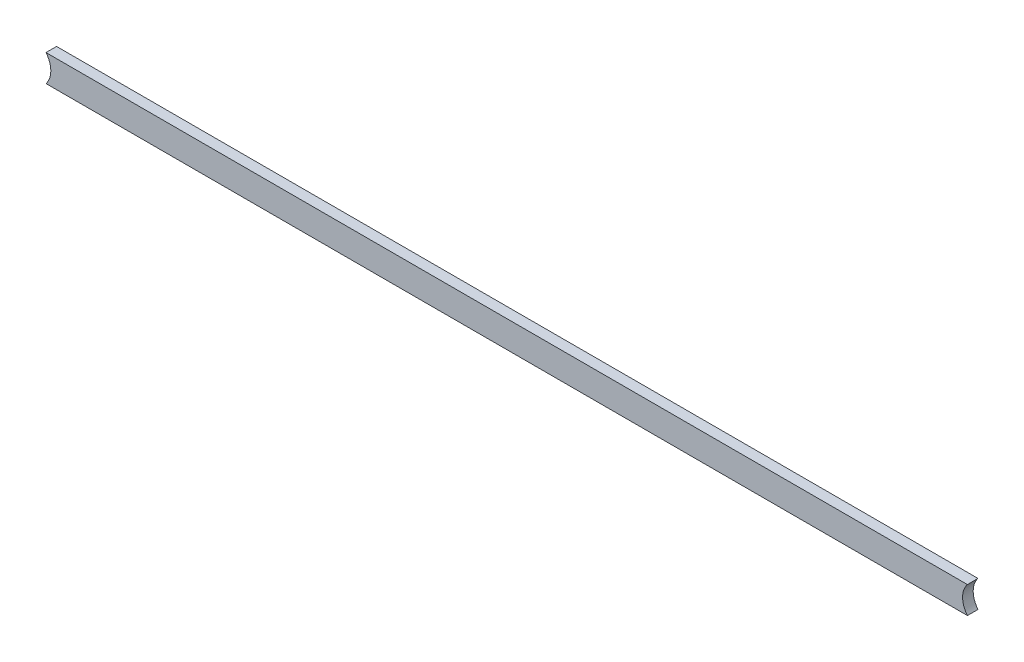
ISO-10303-21;
HEADER;
FILE_DESCRIPTION(('STEP AP214'),'2;1');
FILE_NAME('part.step','',(''),(''),'','','');
FILE_SCHEMA(('AUTOMOTIVE_DESIGN { 1 0 10303 214 1 1 1 1 }'));
ENDSEC;
DATA;
#1=APPLICATION_CONTEXT('core data for automotive mechanical design processes');
#2=APPLICATION_PROTOCOL_DEFINITION('international standard','automotive_design',2000,#1);
#3=PRODUCT_CONTEXT('',#1,'mechanical');
#4=PRODUCT('Part','Part','',(#3));
#5=PRODUCT_RELATED_PRODUCT_CATEGORY('part','',(#4));
#6=PRODUCT_DEFINITION_FORMATION('','',#4);
#7=PRODUCT_DEFINITION_CONTEXT('part definition',#1,'design');
#8=PRODUCT_DEFINITION('design','',#6,#7);
#9=PRODUCT_DEFINITION_SHAPE('','',#8);
#10=(LENGTH_UNIT() NAMED_UNIT(*) SI_UNIT(.MILLI.,.METRE.));
#11=(NAMED_UNIT(*) PLANE_ANGLE_UNIT() SI_UNIT($,.RADIAN.));
#12=(NAMED_UNIT(*) SI_UNIT($,.STERADIAN.) SOLID_ANGLE_UNIT());
#13=UNCERTAINTY_MEASURE_WITH_UNIT(LENGTH_MEASURE(1.E-05),#10,'distance_accuracy_value','');
#14=(GEOMETRIC_REPRESENTATION_CONTEXT(3) GLOBAL_UNCERTAINTY_ASSIGNED_CONTEXT((#13)) GLOBAL_UNIT_ASSIGNED_CONTEXT((#10,
#11,#12)) REPRESENTATION_CONTEXT('',''));
#15=CARTESIAN_POINT('',(0.,0.,0.));
#16=DIRECTION('',(0.,0.,1.));
#17=DIRECTION('',(1.,0.,0.));
#18=AXIS2_PLACEMENT_3D('',#15,#16,#17);
#19=CARTESIAN_POINT('',(112.831003818748,57.404,0.));
#20=DIRECTION('',(0.,1.,0.));
#21=DIRECTION('',(1.,0.,0.));
#22=AXIS2_PLACEMENT_3D('',#19,#20,#21);
#23=PLANE('',#22);
#24=DIRECTION('',(1.,0.,0.));
#25=VECTOR('',#24,1.);
#26=CARTESIAN_POINT('',(112.522,57.404,0.1999996));
#27=LINE('',#26,#25);
#28=CARTESIAN_POINT('',(112.831003818748,57.404,0.1999996));
#29=VERTEX_POINT('',#28);
#30=CARTESIAN_POINT('',(130.246996181252,57.404,0.1999996));
#31=VERTEX_POINT('',#30);
#32=EDGE_CURVE('E11',#29,#31,#27,.T.);
#33=ORIENTED_EDGE('',*,*,#32,.F.);
#34=DIRECTION('',(0.,0.,1.));
#35=VECTOR('',#34,1.);
#36=CARTESIAN_POINT('',(112.831003818748,57.404,0.));
#37=LINE('',#36,#35);
#38=CARTESIAN_POINT('',(112.831003818748,57.404,0.));
#39=VERTEX_POINT('',#38);
#40=EDGE_CURVE('E24',#39,#29,#37,.T.);
#41=ORIENTED_EDGE('',*,*,#40,.F.);
#42=DIRECTION('',(1.,0.,0.));
#43=VECTOR('',#42,1.);
#44=CARTESIAN_POINT('',(112.522,57.404,0.));
#45=LINE('',#44,#43);
#46=CARTESIAN_POINT('',(130.246996181252,57.404,0.));
#47=VERTEX_POINT('',#46);
#48=EDGE_CURVE('E82',#39,#47,#45,.T.);
#49=ORIENTED_EDGE('',*,*,#48,.T.);
#50=DIRECTION('',(0.,0.,1.));
#51=VECTOR('',#50,1.);
#52=CARTESIAN_POINT('',(130.246996181252,57.404,0.));
#53=LINE('',#52,#51);
#54=EDGE_CURVE('E37',#47,#31,#53,.T.);
#55=ORIENTED_EDGE('',*,*,#54,.T.);
#56=EDGE_LOOP('',(#33,#41,#49,#55));
#57=FACE_BOUND('',#56,.T.);
#58=ADVANCED_FACE('F17',(#57),#23,.F.);
#59=CARTESIAN_POINT('',(130.556,57.658,0.));
#60=DIRECTION('',(0.,0.,-1.));
#61=DIRECTION('',(1.,0.,0.));
#62=AXIS2_PLACEMENT_3D('',#59,#60,#61);
#63=CYLINDRICAL_SURFACE('',#62,0.3999992);
#64=DIRECTION('',(0.,0.,1.));
#65=VECTOR('',#64,1.);
#66=CARTESIAN_POINT('',(130.246996181252,57.912,0.));
#67=LINE('',#66,#65);
#68=CARTESIAN_POINT('',(130.246996181252,57.912,0.));
#69=VERTEX_POINT('',#68);
#70=CARTESIAN_POINT('',(130.246996181252,57.912,0.1999996));
#71=VERTEX_POINT('',#70);
#72=EDGE_CURVE('E97',#69,#71,#67,.T.);
#73=ORIENTED_EDGE('',*,*,#72,.T.);
#74=CARTESIAN_POINT('',(130.556,57.658,0.1999996));
#75=DIRECTION('',(0.,0.,1.));
#76=DIRECTION('',(1.,0.,0.));
#77=AXIS2_PLACEMENT_3D('',#74,#75,#76);
#78=CIRCLE('',#77,0.3999992);
#79=EDGE_CURVE('E94',#71,#31,#78,.T.);
#80=ORIENTED_EDGE('',*,*,#79,.T.);
#81=ORIENTED_EDGE('',*,*,#54,.F.);
#82=CARTESIAN_POINT('',(130.556,57.658,0.));
#83=DIRECTION('',(0.,0.,1.));
#84=DIRECTION('',(1.,0.,0.));
#85=AXIS2_PLACEMENT_3D('',#82,#83,#84);
#86=CIRCLE('',#85,0.3999992);
#87=EDGE_CURVE('E92',#69,#47,#86,.T.);
#88=ORIENTED_EDGE('',*,*,#87,.F.);
#89=EDGE_LOOP('',(#73,#80,#81,#88));
#90=FACE_BOUND('',#89,.T.);
#91=ADVANCED_FACE('F102',(#90),#63,.F.);
#92=CARTESIAN_POINT('',(130.246996181252,57.912,0.));
#93=DIRECTION('',(0.,-1.,0.));
#94=DIRECTION('',(-1.,0.,0.));
#95=AXIS2_PLACEMENT_3D('',#92,#93,#94);
#96=PLANE('',#95);
#97=DIRECTION('',(-1.,0.,0.));
#98=VECTOR('',#97,1.);
#99=CARTESIAN_POINT('',(130.556,57.912,0.1999996));
#100=LINE('',#99,#98);
#101=CARTESIAN_POINT('',(112.831003818748,57.912,0.1999996));
#102=VERTEX_POINT('',#101);
#103=EDGE_CURVE('E89',#71,#102,#100,.T.);
#104=ORIENTED_EDGE('',*,*,#103,.F.);
#105=ORIENTED_EDGE('',*,*,#72,.F.);
#106=DIRECTION('',(-1.,0.,0.));
#107=VECTOR('',#106,1.);
#108=CARTESIAN_POINT('',(130.556,57.912,0.));
#109=LINE('',#108,#107);
#110=CARTESIAN_POINT('',(112.831003818748,57.912,0.));
#111=VERTEX_POINT('',#110);
#112=EDGE_CURVE('E87',#69,#111,#109,.T.);
#113=ORIENTED_EDGE('',*,*,#112,.T.);
#114=DIRECTION('',(0.,0.,1.));
#115=VECTOR('',#114,1.);
#116=CARTESIAN_POINT('',(112.831003818748,57.912,0.));
#117=LINE('',#116,#115);
#118=EDGE_CURVE('E69',#111,#102,#117,.T.);
#119=ORIENTED_EDGE('',*,*,#118,.T.);
#120=EDGE_LOOP('',(#104,#105,#113,#119));
#121=FACE_BOUND('',#120,.T.);
#122=ADVANCED_FACE('F108',(#121),#96,.F.);
#123=CARTESIAN_POINT('',(112.522,57.658,0.));
#124=DIRECTION('',(0.,0.,-1.));
#125=DIRECTION('',(1.,0.,0.));
#126=AXIS2_PLACEMENT_3D('',#123,#124,#125);
#127=CYLINDRICAL_SURFACE('',#126,0.3999992);
#128=DIRECTION('',(0.,0.,1.));
#129=VECTOR('',#128,1.);
#130=CARTESIAN_POINT('',(112.9219992,57.658,0.));
#131=LINE('',#130,#129);
#132=CARTESIAN_POINT('',(112.9219992,57.658,0.));
#133=VERTEX_POINT('',#132);
#134=CARTESIAN_POINT('',(112.9219992,57.658,0.1999996));
#135=VERTEX_POINT('',#134);
#136=EDGE_CURVE('E59',#133,#135,#131,.T.);
#137=ORIENTED_EDGE('',*,*,#136,.T.);
#138=CARTESIAN_POINT('',(112.522,57.658,0.1999996));
#139=DIRECTION('',(0.,0.,1.));
#140=DIRECTION('',(1.,0.,0.));
#141=AXIS2_PLACEMENT_3D('',#138,#139,#140);
#142=CIRCLE('',#141,0.3999992);
#143=EDGE_CURVE('E70',#135,#102,#142,.T.);
#144=ORIENTED_EDGE('',*,*,#143,.T.);
#145=ORIENTED_EDGE('',*,*,#118,.F.);
#146=CARTESIAN_POINT('',(112.522,57.658,0.));
#147=DIRECTION('',(0.,0.,1.));
#148=DIRECTION('',(1.,0.,0.));
#149=AXIS2_PLACEMENT_3D('',#146,#147,#148);
#150=CIRCLE('',#149,0.3999992);
#151=EDGE_CURVE('E73',#133,#111,#150,.T.);
#152=ORIENTED_EDGE('',*,*,#151,.F.);
#153=EDGE_LOOP('',(#137,#144,#145,#152));
#154=FACE_BOUND('',#153,.T.);
#155=ADVANCED_FACE('F74',(#154),#127,.F.);
#156=CARTESIAN_POINT('',(112.522,57.658,0.));
#157=DIRECTION('',(0.,0.,-1.));
#158=DIRECTION('',(1.,0.,0.));
#159=AXIS2_PLACEMENT_3D('',#156,#157,#158);
#160=CYLINDRICAL_SURFACE('',#159,0.3999992);
#161=ORIENTED_EDGE('',*,*,#40,.T.);
#162=CARTESIAN_POINT('',(112.522,57.658,0.1999996));
#163=DIRECTION('',(0.,0.,1.));
#164=DIRECTION('',(1.,0.,0.));
#165=AXIS2_PLACEMENT_3D('',#162,#163,#164);
#166=CIRCLE('',#165,0.3999992);
#167=EDGE_CURVE('E65',#29,#135,#166,.T.);
#168=ORIENTED_EDGE('',*,*,#167,.T.);
#169=ORIENTED_EDGE('',*,*,#136,.F.);
#170=EDGE_CURVE('E63',#39,#133,#150,.T.);
#171=ORIENTED_EDGE('',*,*,#170,.F.);
#172=EDGE_LOOP('',(#161,#168,#169,#171));
#173=FACE_BOUND('',#172,.T.);
#174=ADVANCED_FACE('F61',(#173),#160,.F.);
#175=CARTESIAN_POINT('',(112.522,57.404,0.));
#176=DIRECTION('',(0.,0.,-1.));
#177=DIRECTION('',(-1.,0.,0.));
#178=AXIS2_PLACEMENT_3D('',#175,#176,#177);
#179=PLANE('',#178);
#180=ORIENTED_EDGE('',*,*,#48,.F.);
#181=ORIENTED_EDGE('',*,*,#170,.T.);
#182=ORIENTED_EDGE('',*,*,#151,.T.);
#183=ORIENTED_EDGE('',*,*,#112,.F.);
#184=ORIENTED_EDGE('',*,*,#87,.T.);
#185=EDGE_LOOP('',(#180,#181,#182,#183,#184));
#186=FACE_BOUND('',#185,.T.);
#187=ADVANCED_FACE('F80',(#186),#179,.T.);
#188=CARTESIAN_POINT('',(112.522,57.404,0.1999996));
#189=DIRECTION('',(0.,0.,-1.));
#190=DIRECTION('',(-1.,0.,0.));
#191=AXIS2_PLACEMENT_3D('',#188,#189,#190);
#192=PLANE('',#191);
#193=ORIENTED_EDGE('',*,*,#167,.F.);
#194=ORIENTED_EDGE('',*,*,#32,.T.);
#195=ORIENTED_EDGE('',*,*,#79,.F.);
#196=ORIENTED_EDGE('',*,*,#103,.T.);
#197=ORIENTED_EDGE('',*,*,#143,.F.);
#198=EDGE_LOOP('',(#193,#194,#195,#196,#197));
#199=FACE_BOUND('',#198,.T.);
#200=ADVANCED_FACE('F106',(#199),#192,.F.);
#201=CLOSED_SHELL('',(#58,#91,#122,#155,#174,#187,#200));
#202=MANIFOLD_SOLID_BREP('B1',#201);
#203=ADVANCED_BREP_SHAPE_REPRESENTATION('',(#18,#202),#14);
#204=SHAPE_DEFINITION_REPRESENTATION(#9,#203);
ENDSEC;
END-ISO-10303-21;
